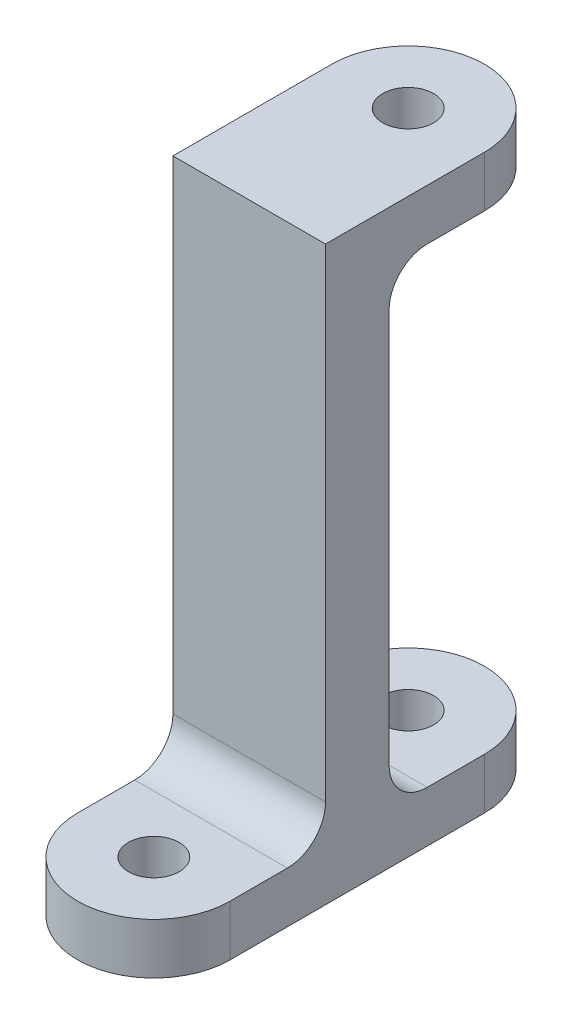
ISO-10303-21;
HEADER;
FILE_DESCRIPTION(('STEP AP214'),'2;1');
FILE_NAME('part.step','',(''),(''),'','','');
FILE_SCHEMA(('AUTOMOTIVE_DESIGN { 1 0 10303 214 1 1 1 1 }'));
ENDSEC;
DATA;
#1=APPLICATION_CONTEXT('core data for automotive mechanical design processes');
#2=APPLICATION_PROTOCOL_DEFINITION('international standard','automotive_design',2000,#1);
#3=PRODUCT_CONTEXT('',#1,'mechanical');
#4=PRODUCT('Part','Part','',(#3));
#5=PRODUCT_RELATED_PRODUCT_CATEGORY('part','',(#4));
#6=PRODUCT_DEFINITION_FORMATION('','',#4);
#7=PRODUCT_DEFINITION_CONTEXT('part definition',#1,'design');
#8=PRODUCT_DEFINITION('design','',#6,#7);
#9=PRODUCT_DEFINITION_SHAPE('','',#8);
#10=(LENGTH_UNIT() NAMED_UNIT(*) SI_UNIT(.MILLI.,.METRE.));
#11=(NAMED_UNIT(*) PLANE_ANGLE_UNIT() SI_UNIT($,.RADIAN.));
#12=(NAMED_UNIT(*) SI_UNIT($,.STERADIAN.) SOLID_ANGLE_UNIT());
#13=UNCERTAINTY_MEASURE_WITH_UNIT(LENGTH_MEASURE(1.E-05),#10,'distance_accuracy_value','');
#14=(GEOMETRIC_REPRESENTATION_CONTEXT(3) GLOBAL_UNCERTAINTY_ASSIGNED_CONTEXT((#13)) GLOBAL_UNIT_ASSIGNED_CONTEXT((#10,
#11,#12)) REPRESENTATION_CONTEXT('',''));
#15=CARTESIAN_POINT('',(0.,0.,0.));
#16=DIRECTION('',(0.,0.,1.));
#17=DIRECTION('',(1.,0.,0.));
#18=AXIS2_PLACEMENT_3D('',#15,#16,#17);
#19=CARTESIAN_POINT('',(0.,4.,0.));
#20=DIRECTION('',(0.,1.,0.));
#21=DIRECTION('',(0.,0.,1.));
#22=AXIS2_PLACEMENT_3D('',#19,#20,#21);
#23=PLANE('',#22);
#24=CARTESIAN_POINT('',(0.,4.,0.));
#25=DIRECTION('',(0.,1.,0.));
#26=DIRECTION('',(0.,0.,1.));
#27=AXIS2_PLACEMENT_3D('',#24,#25,#26);
#28=CIRCLE('',#27,2.);
#29=CARTESIAN_POINT('',(0.,4.,2.));
#30=VERTEX_POINT('',#29);
#31=EDGE_CURVE('E182',#30,#30,#28,.T.);
#32=ORIENTED_EDGE('',*,*,#31,.F.);
#33=EDGE_LOOP('',(#32));
#34=FACE_BOUND('',#33,.T.);
#35=DIRECTION('',(0.,0.,1.));
#36=VECTOR('',#35,1.);
#37=CARTESIAN_POINT('',(6.,4.,0.));
#38=LINE('',#37,#36);
#39=CARTESIAN_POINT('',(6.,4.,-4.5));
#40=VERTEX_POINT('',#39);
#41=CARTESIAN_POINT('',(6.,4.,0.));
#42=VERTEX_POINT('',#41);
#43=EDGE_CURVE('E174',#40,#42,#38,.T.);
#44=ORIENTED_EDGE('',*,*,#43,.F.);
#45=DIRECTION('',(-1.,0.,0.));
#46=VECTOR('',#45,1.);
#47=CARTESIAN_POINT('',(-6.,4.,-4.5));
#48=LINE('',#47,#46);
#49=CARTESIAN_POINT('',(-6.,4.,-4.5));
#50=VERTEX_POINT('',#49);
#51=EDGE_CURVE('E221',#40,#50,#48,.T.);
#52=ORIENTED_EDGE('',*,*,#51,.T.);
#53=DIRECTION('',(0.,0.,1.));
#54=VECTOR('',#53,1.);
#55=CARTESIAN_POINT('',(-6.,4.,0.));
#56=LINE('',#55,#54);
#57=CARTESIAN_POINT('',(-6.,4.,0.));
#58=VERTEX_POINT('',#57);
#59=EDGE_CURVE('E176',#50,#58,#56,.T.);
#60=ORIENTED_EDGE('',*,*,#59,.T.);
#61=CARTESIAN_POINT('',(0.,4.,0.));
#62=DIRECTION('',(0.,1.,0.));
#63=DIRECTION('',(0.,0.,1.));
#64=AXIS2_PLACEMENT_3D('',#61,#62,#63);
#65=CIRCLE('',#64,6.);
#66=EDGE_CURVE('E179',#58,#42,#65,.T.);
#67=ORIENTED_EDGE('',*,*,#66,.T.);
#68=EDGE_LOOP('',(#44,#52,#60,#67));
#69=FACE_BOUND('',#68,.T.);
#70=ADVANCED_FACE('F34',(#34,#69),#23,.T.);
#71=CARTESIAN_POINT('',(6.,4.,0.));
#72=DIRECTION('',(1.,0.,0.));
#73=DIRECTION('',(0.,0.,-1.));
#74=AXIS2_PLACEMENT_3D('',#71,#72,#73);
#75=PLANE('',#74);
#76=DIRECTION('',(0.,0.,1.));
#77=VECTOR('',#76,1.);
#78=CARTESIAN_POINT('',(6.,0.,0.));
#79=LINE('',#78,#77);
#80=CARTESIAN_POINT('',(6.,0.,-20.));
#81=VERTEX_POINT('',#80);
#82=CARTESIAN_POINT('',(6.,0.,0.));
#83=VERTEX_POINT('',#82);
#84=EDGE_CURVE('E166',#81,#83,#79,.T.);
#85=ORIENTED_EDGE('',*,*,#84,.F.);
#86=DIRECTION('',(0.,-1.,0.));
#87=VECTOR('',#86,1.);
#88=CARTESIAN_POINT('',(6.,4.,-20.));
#89=LINE('',#88,#87);
#90=CARTESIAN_POINT('',(6.,4.,-20.));
#91=VERTEX_POINT('',#90);
#92=EDGE_CURVE('E211',#91,#81,#89,.T.);
#93=ORIENTED_EDGE('',*,*,#92,.F.);
#94=CARTESIAN_POINT('',(6.,4.,-15.5));
#95=VERTEX_POINT('',#94);
#96=EDGE_CURVE('E171',#91,#95,#38,.T.);
#97=ORIENTED_EDGE('',*,*,#96,.T.);
#98=CARTESIAN_POINT('',(6.,7.,-15.5));
#99=DIRECTION('',(1.,0.,0.));
#100=DIRECTION('',(0.,0.,-1.));
#101=AXIS2_PLACEMENT_3D('',#98,#99,#100);
#102=CIRCLE('',#101,3.);
#103=CARTESIAN_POINT('',(6.,7.,-12.5));
#104=VERTEX_POINT('',#103);
#105=EDGE_CURVE('E11',#95,#104,#102,.F.);
#106=ORIENTED_EDGE('',*,*,#105,.T.);
#107=DIRECTION('',(0.,-1.,0.));
#108=VECTOR('',#107,1.);
#109=CARTESIAN_POINT('',(6.,41.,-12.5));
#110=LINE('',#109,#108);
#111=CARTESIAN_POINT('',(6.,38.,-12.5));
#112=VERTEX_POINT('',#111);
#113=EDGE_CURVE('E167',#112,#104,#110,.T.);
#114=ORIENTED_EDGE('',*,*,#113,.F.);
#115=CARTESIAN_POINT('',(6.,38.,-15.5));
#116=DIRECTION('',(1.,0.,0.));
#117=DIRECTION('',(0.,0.,-1.));
#118=AXIS2_PLACEMENT_3D('',#115,#116,#117);
#119=CIRCLE('',#118,3.);
#120=CARTESIAN_POINT('',(6.,41.,-15.5));
#121=VERTEX_POINT('',#120);
#122=EDGE_CURVE('E229',#112,#121,#119,.F.);
#123=ORIENTED_EDGE('',*,*,#122,.T.);
#124=DIRECTION('',(0.,0.,-1.));
#125=VECTOR('',#124,1.);
#126=CARTESIAN_POINT('',(6.,41.,0.));
#127=LINE('',#126,#125);
#128=CARTESIAN_POINT('',(6.,41.,-20.));
#129=VERTEX_POINT('',#128);
#130=EDGE_CURVE('E154',#121,#129,#127,.T.);
#131=ORIENTED_EDGE('',*,*,#130,.T.);
#132=DIRECTION('',(0.,-1.,0.));
#133=VECTOR('',#132,1.);
#134=CARTESIAN_POINT('',(6.,45.,-20.));
#135=LINE('',#134,#133);
#136=CARTESIAN_POINT('',(6.,45.,-20.));
#137=VERTEX_POINT('',#136);
#138=EDGE_CURVE('E133',#137,#129,#135,.T.);
#139=ORIENTED_EDGE('',*,*,#138,.F.);
#140=DIRECTION('',(0.,0.,-1.));
#141=VECTOR('',#140,1.);
#142=CARTESIAN_POINT('',(6.,45.,0.));
#143=LINE('',#142,#141);
#144=CARTESIAN_POINT('',(6.,45.,-7.5));
#145=VERTEX_POINT('',#144);
#146=EDGE_CURVE('E140',#145,#137,#143,.T.);
#147=ORIENTED_EDGE('',*,*,#146,.F.);
#148=DIRECTION('',(0.,-1.,0.));
#149=VECTOR('',#148,1.);
#150=CARTESIAN_POINT('',(6.,41.,-7.5));
#151=LINE('',#150,#149);
#152=CARTESIAN_POINT('',(6.,7.,-7.5));
#153=VERTEX_POINT('',#152);
#154=EDGE_CURVE('E164',#145,#153,#151,.T.);
#155=ORIENTED_EDGE('',*,*,#154,.T.);
#156=CARTESIAN_POINT('',(6.,7.,-4.5));
#157=DIRECTION('',(1.,0.,0.));
#158=DIRECTION('',(0.,0.,-1.));
#159=AXIS2_PLACEMENT_3D('',#156,#157,#158);
#160=CIRCLE('',#159,3.);
#161=EDGE_CURVE('E233',#153,#40,#160,.F.);
#162=ORIENTED_EDGE('',*,*,#161,.T.);
#163=ORIENTED_EDGE('',*,*,#43,.T.);
#164=DIRECTION('',(0.,-1.,0.));
#165=VECTOR('',#164,1.);
#166=CARTESIAN_POINT('',(6.,4.,0.));
#167=LINE('',#166,#165);
#168=EDGE_CURVE('E188',#42,#83,#167,.T.);
#169=ORIENTED_EDGE('',*,*,#168,.T.);
#170=EDGE_LOOP('',(#85,#93,#97,#106,#114,#123,#131,#139,#147,#155,#162,#163,#169));
#171=FACE_BOUND('',#170,.T.);
#172=ADVANCED_FACE('F152',(#171),#75,.T.);
#173=CARTESIAN_POINT('',(0.,4.,-20.));
#174=DIRECTION('',(0.,-1.,0.));
#175=DIRECTION('',(0.,0.,-1.));
#176=AXIS2_PLACEMENT_3D('',#173,#174,#175);
#177=CYLINDRICAL_SURFACE('',#176,6.);
#178=CARTESIAN_POINT('',(0.,0.,-20.));
#179=DIRECTION('',(0.,1.,0.));
#180=DIRECTION('',(0.,0.,1.));
#181=AXIS2_PLACEMENT_3D('',#178,#179,#180);
#182=CIRCLE('',#181,6.);
#183=CARTESIAN_POINT('',(-6.,0.,-20.));
#184=VERTEX_POINT('',#183);
#185=EDGE_CURVE('E191',#81,#184,#182,.T.);
#186=ORIENTED_EDGE('',*,*,#185,.T.);
#187=DIRECTION('',(0.,-1.,0.));
#188=VECTOR('',#187,1.);
#189=CARTESIAN_POINT('',(-6.,4.,-20.));
#190=LINE('',#189,#188);
#191=CARTESIAN_POINT('',(-6.,4.,-20.));
#192=VERTEX_POINT('',#191);
#193=EDGE_CURVE('E208',#192,#184,#190,.T.);
#194=ORIENTED_EDGE('',*,*,#193,.F.);
#195=CARTESIAN_POINT('',(0.,4.,-20.));
#196=DIRECTION('',(0.,1.,0.));
#197=DIRECTION('',(0.,0.,1.));
#198=AXIS2_PLACEMENT_3D('',#195,#196,#197);
#199=CIRCLE('',#198,6.);
#200=EDGE_CURVE('E173',#91,#192,#199,.T.);
#201=ORIENTED_EDGE('',*,*,#200,.F.);
#202=ORIENTED_EDGE('',*,*,#92,.T.);
#203=EDGE_LOOP('',(#186,#194,#201,#202));
#204=FACE_BOUND('',#203,.T.);
#205=ADVANCED_FACE('F284',(#204),#177,.T.);
#206=CARTESIAN_POINT('',(-6.,4.,0.));
#207=DIRECTION('',(1.,0.,0.));
#208=DIRECTION('',(0.,0.,-1.));
#209=AXIS2_PLACEMENT_3D('',#206,#207,#208);
#210=PLANE('',#209);
#211=DIRECTION('',(0.,0.,1.));
#212=VECTOR('',#211,1.);
#213=CARTESIAN_POINT('',(-6.,0.,0.));
#214=LINE('',#213,#212);
#215=CARTESIAN_POINT('',(-6.,0.,0.));
#216=VERTEX_POINT('',#215);
#217=EDGE_CURVE('E193',#184,#216,#214,.T.);
#218=ORIENTED_EDGE('',*,*,#217,.T.);
#219=DIRECTION('',(0.,-1.,0.));
#220=VECTOR('',#219,1.);
#221=CARTESIAN_POINT('',(-6.,4.,0.));
#222=LINE('',#221,#220);
#223=EDGE_CURVE('E205',#58,#216,#222,.T.);
#224=ORIENTED_EDGE('',*,*,#223,.F.);
#225=ORIENTED_EDGE('',*,*,#59,.F.);
#226=CARTESIAN_POINT('',(-6.,7.,-4.5));
#227=DIRECTION('',(1.,0.,0.));
#228=DIRECTION('',(0.,0.,-1.));
#229=AXIS2_PLACEMENT_3D('',#226,#227,#228);
#230=CIRCLE('',#229,3.);
#231=CARTESIAN_POINT('',(-6.,7.,-7.5));
#232=VERTEX_POINT('',#231);
#233=EDGE_CURVE('E231',#50,#232,#230,.T.);
#234=ORIENTED_EDGE('',*,*,#233,.T.);
#235=DIRECTION('',(0.,-1.,0.));
#236=VECTOR('',#235,1.);
#237=CARTESIAN_POINT('',(-6.,41.,-7.5));
#238=LINE('',#237,#236);
#239=CARTESIAN_POINT('',(-6.,45.,-7.5));
#240=VERTEX_POINT('',#239);
#241=EDGE_CURVE('E156',#240,#232,#238,.T.);
#242=ORIENTED_EDGE('',*,*,#241,.F.);
#243=DIRECTION('',(0.,0.,1.));
#244=VECTOR('',#243,1.);
#245=CARTESIAN_POINT('',(-6.,45.,0.));
#246=LINE('',#245,#244);
#247=CARTESIAN_POINT('',(-6.,45.,-20.));
#248=VERTEX_POINT('',#247);
#249=EDGE_CURVE('E139',#248,#240,#246,.T.);
#250=ORIENTED_EDGE('',*,*,#249,.F.);
#251=DIRECTION('',(0.,-1.,0.));
#252=VECTOR('',#251,1.);
#253=CARTESIAN_POINT('',(-6.,45.,-20.));
#254=LINE('',#253,#252);
#255=CARTESIAN_POINT('',(-6.,41.,-20.));
#256=VERTEX_POINT('',#255);
#257=EDGE_CURVE('E135',#248,#256,#254,.T.);
#258=ORIENTED_EDGE('',*,*,#257,.T.);
#259=DIRECTION('',(0.,0.,1.));
#260=VECTOR('',#259,1.);
#261=CARTESIAN_POINT('',(-6.,41.,0.));
#262=LINE('',#261,#260);
#263=CARTESIAN_POINT('',(-6.,41.,-15.5));
#264=VERTEX_POINT('',#263);
#265=EDGE_CURVE('E256',#256,#264,#262,.T.);
#266=ORIENTED_EDGE('',*,*,#265,.T.);
#267=CARTESIAN_POINT('',(-6.,38.,-15.5));
#268=DIRECTION('',(1.,0.,0.));
#269=DIRECTION('',(0.,0.,-1.));
#270=AXIS2_PLACEMENT_3D('',#267,#268,#269);
#271=CIRCLE('',#270,3.);
#272=CARTESIAN_POINT('',(-6.,38.,-12.5));
#273=VERTEX_POINT('',#272);
#274=EDGE_CURVE('E227',#264,#273,#271,.T.);
#275=ORIENTED_EDGE('',*,*,#274,.T.);
#276=DIRECTION('',(0.,-1.,0.));
#277=VECTOR('',#276,1.);
#278=CARTESIAN_POINT('',(-6.,41.,-12.5));
#279=LINE('',#278,#277);
#280=CARTESIAN_POINT('',(-6.,7.,-12.5));
#281=VERTEX_POINT('',#280);
#282=EDGE_CURVE('E159',#273,#281,#279,.T.);
#283=ORIENTED_EDGE('',*,*,#282,.T.);
#284=CARTESIAN_POINT('',(-6.,7.,-15.5));
#285=DIRECTION('',(1.,0.,0.));
#286=DIRECTION('',(0.,0.,-1.));
#287=AXIS2_PLACEMENT_3D('',#284,#285,#286);
#288=CIRCLE('',#287,3.);
#289=CARTESIAN_POINT('',(-6.,4.,-15.5));
#290=VERTEX_POINT('',#289);
#291=EDGE_CURVE('E42',#281,#290,#288,.T.);
#292=ORIENTED_EDGE('',*,*,#291,.T.);
#293=EDGE_CURVE('E177',#192,#290,#56,.T.);
#294=ORIENTED_EDGE('',*,*,#293,.F.);
#295=ORIENTED_EDGE('',*,*,#193,.T.);
#296=EDGE_LOOP('',(#218,#224,#225,#234,#242,#250,#258,#266,#275,#283,#292,#294,#295));
#297=FACE_BOUND('',#296,.T.);
#298=ADVANCED_FACE('F244',(#297),#210,.F.);
#299=CARTESIAN_POINT('',(0.,4.,0.));
#300=DIRECTION('',(0.,-1.,0.));
#301=DIRECTION('',(0.,0.,-1.));
#302=AXIS2_PLACEMENT_3D('',#299,#300,#301);
#303=CYLINDRICAL_SURFACE('',#302,2.);
#304=ORIENTED_EDGE('',*,*,#31,.T.);
#305=EDGE_LOOP('',(#304));
#306=FACE_BOUND('',#305,.T.);
#307=CARTESIAN_POINT('',(0.,0.,0.));
#308=DIRECTION('',(0.,1.,0.));
#309=DIRECTION('',(0.,0.,1.));
#310=AXIS2_PLACEMENT_3D('',#307,#308,#309);
#311=CIRCLE('',#310,2.);
#312=CARTESIAN_POINT('',(0.,0.,2.));
#313=VERTEX_POINT('',#312);
#314=EDGE_CURVE('E198',#313,#313,#311,.T.);
#315=ORIENTED_EDGE('',*,*,#314,.F.);
#316=EDGE_LOOP('',(#315));
#317=FACE_BOUND('',#316,.T.);
#318=ADVANCED_FACE('F375',(#306,#317),#303,.F.);
#319=CARTESIAN_POINT('',(0.,4.,0.));
#320=DIRECTION('',(0.,-1.,0.));
#321=DIRECTION('',(0.,0.,-1.));
#322=AXIS2_PLACEMENT_3D('',#319,#320,#321);
#323=CYLINDRICAL_SURFACE('',#322,6.);
#324=CARTESIAN_POINT('',(0.,0.,0.));
#325=DIRECTION('',(0.,1.,0.));
#326=DIRECTION('',(0.,0.,1.));
#327=AXIS2_PLACEMENT_3D('',#324,#325,#326);
#328=CIRCLE('',#327,6.);
#329=EDGE_CURVE('E195',#216,#83,#328,.T.);
#330=ORIENTED_EDGE('',*,*,#329,.T.);
#331=ORIENTED_EDGE('',*,*,#168,.F.);
#332=ORIENTED_EDGE('',*,*,#66,.F.);
#333=ORIENTED_EDGE('',*,*,#223,.T.);
#334=EDGE_LOOP('',(#330,#331,#332,#333));
#335=FACE_BOUND('',#334,.T.);
#336=ADVANCED_FACE('F297',(#335),#323,.T.);
#337=CARTESIAN_POINT('',(0.,4.,-20.));
#338=DIRECTION('',(0.,-1.,0.));
#339=DIRECTION('',(0.,0.,-1.));
#340=AXIS2_PLACEMENT_3D('',#337,#338,#339);
#341=CYLINDRICAL_SURFACE('',#340,2.);
#342=CARTESIAN_POINT('',(0.,4.,-20.));
#343=DIRECTION('',(0.,1.,0.));
#344=DIRECTION('',(0.,0.,1.));
#345=AXIS2_PLACEMENT_3D('',#342,#343,#344);
#346=CIRCLE('',#345,2.);
#347=CARTESIAN_POINT('',(0.,4.,-18.));
#348=VERTEX_POINT('',#347);
#349=EDGE_CURVE('E185',#348,#348,#346,.T.);
#350=ORIENTED_EDGE('',*,*,#349,.T.);
#351=EDGE_LOOP('',(#350));
#352=FACE_BOUND('',#351,.T.);
#353=CARTESIAN_POINT('',(0.,0.,-20.));
#354=DIRECTION('',(0.,1.,0.));
#355=DIRECTION('',(0.,0.,1.));
#356=AXIS2_PLACEMENT_3D('',#353,#354,#355);
#357=CIRCLE('',#356,2.);
#358=CARTESIAN_POINT('',(0.,0.,-18.));
#359=VERTEX_POINT('',#358);
#360=EDGE_CURVE('E201',#359,#359,#357,.T.);
#361=ORIENTED_EDGE('',*,*,#360,.F.);
#362=EDGE_LOOP('',(#361));
#363=FACE_BOUND('',#362,.T.);
#364=ADVANCED_FACE('F291',(#352,#363),#341,.F.);
#365=ORIENTED_EDGE('',*,*,#293,.T.);
#366=DIRECTION('',(-1.,0.,0.));
#367=VECTOR('',#366,1.);
#368=CARTESIAN_POINT('',(0.,4.,-15.5));
#369=LINE('',#368,#367);
#370=EDGE_CURVE('E55',#290,#95,#369,.F.);
#371=ORIENTED_EDGE('',*,*,#370,.T.);
#372=ORIENTED_EDGE('',*,*,#96,.F.);
#373=ORIENTED_EDGE('',*,*,#200,.T.);
#374=EDGE_LOOP('',(#365,#371,#372,#373));
#375=FACE_BOUND('',#374,.T.);
#376=ORIENTED_EDGE('',*,*,#349,.F.);
#377=EDGE_LOOP('',(#376));
#378=FACE_BOUND('',#377,.T.);
#379=ADVANCED_FACE('F280',(#375,#378),#23,.T.);
#380=CARTESIAN_POINT('',(0.,0.,0.));
#381=DIRECTION('',(0.,1.,0.));
#382=DIRECTION('',(0.,0.,1.));
#383=AXIS2_PLACEMENT_3D('',#380,#381,#382);
#384=PLANE('',#383);
#385=ORIENTED_EDGE('',*,*,#84,.T.);
#386=ORIENTED_EDGE('',*,*,#329,.F.);
#387=ORIENTED_EDGE('',*,*,#217,.F.);
#388=ORIENTED_EDGE('',*,*,#185,.F.);
#389=EDGE_LOOP('',(#385,#386,#387,#388));
#390=FACE_BOUND('',#389,.T.);
#391=ORIENTED_EDGE('',*,*,#314,.T.);
#392=EDGE_LOOP('',(#391));
#393=FACE_BOUND('',#392,.T.);
#394=ORIENTED_EDGE('',*,*,#360,.T.);
#395=EDGE_LOOP('',(#394));
#396=FACE_BOUND('',#395,.T.);
#397=ADVANCED_FACE('F290',(#390,#393,#396),#384,.F.);
#398=CARTESIAN_POINT('',(6.,41.,-7.5));
#399=DIRECTION('',(0.,0.,1.));
#400=DIRECTION('',(1.,0.,0.));
#401=AXIS2_PLACEMENT_3D('',#398,#399,#400);
#402=PLANE('',#401);
#403=ORIENTED_EDGE('',*,*,#241,.T.);
#404=DIRECTION('',(-1.,0.,0.));
#405=VECTOR('',#404,1.);
#406=CARTESIAN_POINT('',(6.,7.,-7.5));
#407=LINE('',#406,#405);
#408=EDGE_CURVE('E224',#232,#153,#407,.F.);
#409=ORIENTED_EDGE('',*,*,#408,.T.);
#410=ORIENTED_EDGE('',*,*,#154,.F.);
#411=DIRECTION('',(1.,0.,0.));
#412=VECTOR('',#411,1.);
#413=CARTESIAN_POINT('',(0.,45.,-7.5));
#414=LINE('',#413,#412);
#415=EDGE_CURVE('E146',#240,#145,#414,.T.);
#416=ORIENTED_EDGE('',*,*,#415,.F.);
#417=EDGE_LOOP('',(#403,#409,#410,#416));
#418=FACE_BOUND('',#417,.T.);
#419=ADVANCED_FACE('F247',(#418),#402,.T.);
#420=CARTESIAN_POINT('',(6.,41.,-12.5));
#421=DIRECTION('',(0.,0.,1.));
#422=DIRECTION('',(1.,0.,0.));
#423=AXIS2_PLACEMENT_3D('',#420,#421,#422);
#424=PLANE('',#423);
#425=ORIENTED_EDGE('',*,*,#282,.F.);
#426=DIRECTION('',(-1.,0.,0.));
#427=VECTOR('',#426,1.);
#428=CARTESIAN_POINT('',(6.,38.,-12.5));
#429=LINE('',#428,#427);
#430=EDGE_CURVE('E219',#273,#112,#429,.F.);
#431=ORIENTED_EDGE('',*,*,#430,.T.);
#432=ORIENTED_EDGE('',*,*,#113,.T.);
#433=DIRECTION('',(-1.,0.,0.));
#434=VECTOR('',#433,1.);
#435=CARTESIAN_POINT('',(6.,7.,-12.5));
#436=LINE('',#435,#434);
#437=EDGE_CURVE('E216',#104,#281,#436,.T.);
#438=ORIENTED_EDGE('',*,*,#437,.T.);
#439=EDGE_LOOP('',(#425,#431,#432,#438));
#440=FACE_BOUND('',#439,.T.);
#441=ADVANCED_FACE('F314',(#440),#424,.F.);
#442=CARTESIAN_POINT('',(0.,41.,0.));
#443=DIRECTION('',(0.,1.,0.));
#444=DIRECTION('',(0.,0.,1.));
#445=AXIS2_PLACEMENT_3D('',#442,#443,#444);
#446=PLANE('',#445);
#447=CARTESIAN_POINT('',(0.,41.,-20.));
#448=DIRECTION('',(0.,1.,0.));
#449=DIRECTION('',(0.,0.,1.));
#450=AXIS2_PLACEMENT_3D('',#447,#448,#449);
#451=CIRCLE('',#450,2.);
#452=CARTESIAN_POINT('',(0.,41.,-18.));
#453=VERTEX_POINT('',#452);
#454=EDGE_CURVE('E251',#453,#453,#451,.T.);
#455=ORIENTED_EDGE('',*,*,#454,.T.);
#456=EDGE_LOOP('',(#455));
#457=FACE_BOUND('',#456,.T.);
#458=ORIENTED_EDGE('',*,*,#130,.F.);
#459=DIRECTION('',(-1.,0.,0.));
#460=VECTOR('',#459,1.);
#461=CARTESIAN_POINT('',(-6.,41.,-15.5));
#462=LINE('',#461,#460);
#463=EDGE_CURVE('E213',#121,#264,#462,.T.);
#464=ORIENTED_EDGE('',*,*,#463,.T.);
#465=ORIENTED_EDGE('',*,*,#265,.F.);
#466=CARTESIAN_POINT('',(0.,41.,-20.));
#467=DIRECTION('',(0.,1.,0.));
#468=DIRECTION('',(0.,0.,1.));
#469=AXIS2_PLACEMENT_3D('',#466,#467,#468);
#470=CIRCLE('',#469,6.);
#471=EDGE_CURVE('E255',#129,#256,#470,.T.);
#472=ORIENTED_EDGE('',*,*,#471,.F.);
#473=EDGE_LOOP('',(#458,#464,#465,#472));
#474=FACE_BOUND('',#473,.T.);
#475=ADVANCED_FACE('F318',(#457,#474),#446,.F.);
#476=CARTESIAN_POINT('',(0.,45.,-20.));
#477=DIRECTION('',(0.,-1.,0.));
#478=DIRECTION('',(0.,0.,-1.));
#479=AXIS2_PLACEMENT_3D('',#476,#477,#478);
#480=CYLINDRICAL_SURFACE('',#479,6.);
#481=ORIENTED_EDGE('',*,*,#471,.T.);
#482=ORIENTED_EDGE('',*,*,#257,.F.);
#483=CARTESIAN_POINT('',(0.,45.,-20.));
#484=DIRECTION('',(0.,1.,0.));
#485=DIRECTION('',(0.,0.,1.));
#486=AXIS2_PLACEMENT_3D('',#483,#484,#485);
#487=CIRCLE('',#486,6.);
#488=EDGE_CURVE('E129',#137,#248,#487,.T.);
#489=ORIENTED_EDGE('',*,*,#488,.F.);
#490=ORIENTED_EDGE('',*,*,#138,.T.);
#491=EDGE_LOOP('',(#481,#482,#489,#490));
#492=FACE_BOUND('',#491,.T.);
#493=ADVANCED_FACE('F131',(#492),#480,.T.);
#494=CARTESIAN_POINT('',(0.,45.,-20.));
#495=DIRECTION('',(0.,-1.,0.));
#496=DIRECTION('',(0.,0.,-1.));
#497=AXIS2_PLACEMENT_3D('',#494,#495,#496);
#498=CYLINDRICAL_SURFACE('',#497,2.);
#499=CARTESIAN_POINT('',(0.,45.,-20.));
#500=DIRECTION('',(0.,1.,0.));
#501=DIRECTION('',(0.,0.,1.));
#502=AXIS2_PLACEMENT_3D('',#499,#500,#501);
#503=CIRCLE('',#502,2.);
#504=CARTESIAN_POINT('',(0.,45.,-18.));
#505=VERTEX_POINT('',#504);
#506=EDGE_CURVE('E149',#505,#505,#503,.T.);
#507=ORIENTED_EDGE('',*,*,#506,.T.);
#508=EDGE_LOOP('',(#507));
#509=FACE_BOUND('',#508,.T.);
#510=ORIENTED_EDGE('',*,*,#454,.F.);
#511=EDGE_LOOP('',(#510));
#512=FACE_BOUND('',#511,.T.);
#513=ADVANCED_FACE('F263',(#509,#512),#498,.F.);
#514=CARTESIAN_POINT('',(0.,45.,0.));
#515=DIRECTION('',(0.,1.,0.));
#516=DIRECTION('',(0.,0.,1.));
#517=AXIS2_PLACEMENT_3D('',#514,#515,#516);
#518=PLANE('',#517);
#519=ORIENTED_EDGE('',*,*,#506,.F.);
#520=EDGE_LOOP('',(#519));
#521=FACE_BOUND('',#520,.T.);
#522=ORIENTED_EDGE('',*,*,#146,.T.);
#523=ORIENTED_EDGE('',*,*,#488,.T.);
#524=ORIENTED_EDGE('',*,*,#249,.T.);
#525=ORIENTED_EDGE('',*,*,#415,.T.);
#526=EDGE_LOOP('',(#522,#523,#524,#525));
#527=FACE_BOUND('',#526,.T.);
#528=ADVANCED_FACE('F144',(#521,#527),#518,.T.);
#529=CARTESIAN_POINT('',(0.,38.,-15.5));
#530=DIRECTION('',(1.,0.,0.));
#531=DIRECTION('',(0.,0.,-1.));
#532=AXIS2_PLACEMENT_3D('',#529,#530,#531);
#533=CYLINDRICAL_SURFACE('',#532,3.);
#534=ORIENTED_EDGE('',*,*,#122,.F.);
#535=ORIENTED_EDGE('',*,*,#430,.F.);
#536=ORIENTED_EDGE('',*,*,#274,.F.);
#537=ORIENTED_EDGE('',*,*,#463,.F.);
#538=EDGE_LOOP('',(#534,#535,#536,#537));
#539=FACE_BOUND('',#538,.T.);
#540=ADVANCED_FACE('F267',(#539),#533,.F.);
#541=CARTESIAN_POINT('',(0.,7.,-4.5));
#542=DIRECTION('',(1.,0.,0.));
#543=DIRECTION('',(0.,0.,-1.));
#544=AXIS2_PLACEMENT_3D('',#541,#542,#543);
#545=CYLINDRICAL_SURFACE('',#544,3.);
#546=ORIENTED_EDGE('',*,*,#161,.F.);
#547=ORIENTED_EDGE('',*,*,#408,.F.);
#548=ORIENTED_EDGE('',*,*,#233,.F.);
#549=ORIENTED_EDGE('',*,*,#51,.F.);
#550=EDGE_LOOP('',(#546,#547,#548,#549));
#551=FACE_BOUND('',#550,.T.);
#552=ADVANCED_FACE('F243',(#551),#545,.F.);
#553=CARTESIAN_POINT('',(6.,7.,-15.5));
#554=DIRECTION('',(-1.,0.,0.));
#555=DIRECTION('',(0.,0.,1.));
#556=AXIS2_PLACEMENT_3D('',#553,#554,#555);
#557=CYLINDRICAL_SURFACE('',#556,3.);
#558=ORIENTED_EDGE('',*,*,#105,.F.);
#559=ORIENTED_EDGE('',*,*,#370,.F.);
#560=ORIENTED_EDGE('',*,*,#291,.F.);
#561=ORIENTED_EDGE('',*,*,#437,.F.);
#562=EDGE_LOOP('',(#558,#559,#560,#561));
#563=FACE_BOUND('',#562,.T.);
#564=ADVANCED_FACE('F36',(#563),#557,.F.);
#565=CLOSED_SHELL('',(#70,#172,#205,#298,#318,#336,#364,#379,#397,#419,#441,#475,#493,#513,#528,
#540,#552,#564));
#566=MANIFOLD_SOLID_BREP('B2',#565);
#567=ADVANCED_BREP_SHAPE_REPRESENTATION('',(#18,#566),#14);
#568=SHAPE_DEFINITION_REPRESENTATION(#9,#567);
ENDSEC;
END-ISO-10303-21;
